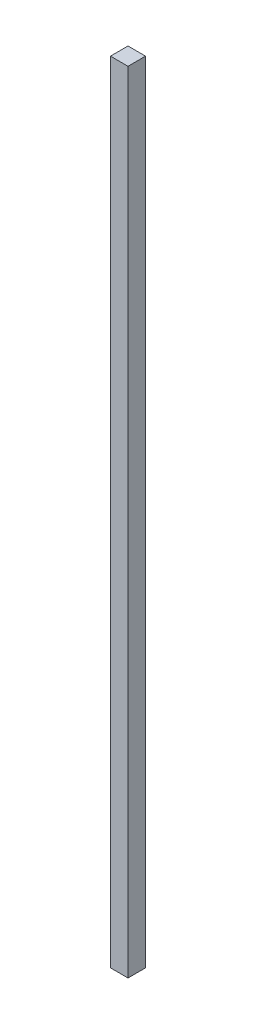
ISO-10303-21;
HEADER;
FILE_DESCRIPTION(('STEP AP214'),'2;1');
FILE_NAME('part.step','',(''),(''),'','','');
FILE_SCHEMA(('AUTOMOTIVE_DESIGN { 1 0 10303 214 1 1 1 1 }'));
ENDSEC;
DATA;
#1=APPLICATION_CONTEXT('core data for automotive mechanical design processes');
#2=APPLICATION_PROTOCOL_DEFINITION('international standard','automotive_design',2000,#1);
#3=PRODUCT_CONTEXT('',#1,'mechanical');
#4=PRODUCT('Part','Part','',(#3));
#5=PRODUCT_RELATED_PRODUCT_CATEGORY('part','',(#4));
#6=PRODUCT_DEFINITION_FORMATION('','',#4);
#7=PRODUCT_DEFINITION_CONTEXT('part definition',#1,'design');
#8=PRODUCT_DEFINITION('design','',#6,#7);
#9=PRODUCT_DEFINITION_SHAPE('','',#8);
#10=(LENGTH_UNIT() NAMED_UNIT(*) SI_UNIT(.MILLI.,.METRE.));
#11=(NAMED_UNIT(*) PLANE_ANGLE_UNIT() SI_UNIT($,.RADIAN.));
#12=(NAMED_UNIT(*) SI_UNIT($,.STERADIAN.) SOLID_ANGLE_UNIT());
#13=UNCERTAINTY_MEASURE_WITH_UNIT(LENGTH_MEASURE(1.E-05),#10,'distance_accuracy_value','');
#14=(GEOMETRIC_REPRESENTATION_CONTEXT(3) GLOBAL_UNCERTAINTY_ASSIGNED_CONTEXT((#13)) GLOBAL_UNIT_ASSIGNED_CONTEXT((#10,
#11,#12)) REPRESENTATION_CONTEXT('',''));
#15=CARTESIAN_POINT('',(0.,0.,0.));
#16=DIRECTION('',(0.,0.,1.));
#17=DIRECTION('',(1.,0.,0.));
#18=AXIS2_PLACEMENT_3D('',#15,#16,#17);
#19=CARTESIAN_POINT('',(10.,900.,-10.));
#20=DIRECTION('',(-1.,0.,0.));
#21=DIRECTION('',(0.,0.,1.));
#22=AXIS2_PLACEMENT_3D('',#19,#20,#21);
#23=PLANE('',#22);
#24=DIRECTION('',(0.,0.,-1.));
#25=VECTOR('',#24,1.);
#26=CARTESIAN_POINT('',(10.,0.,-10.));
#27=LINE('',#26,#25);
#28=CARTESIAN_POINT('',(10.,0.,10.));
#29=VERTEX_POINT('',#28);
#30=CARTESIAN_POINT('',(10.,0.,-10.));
#31=VERTEX_POINT('',#30);
#32=EDGE_CURVE('E100',#29,#31,#27,.T.);
#33=ORIENTED_EDGE('',*,*,#32,.T.);
#34=DIRECTION('',(0.,-1.,0.));
#35=VECTOR('',#34,1.);
#36=CARTESIAN_POINT('',(10.,900.,-10.));
#37=LINE('',#36,#35);
#38=CARTESIAN_POINT('',(10.,900.,-10.));
#39=VERTEX_POINT('',#38);
#40=EDGE_CURVE('E11',#39,#31,#37,.T.);
#41=ORIENTED_EDGE('',*,*,#40,.F.);
#42=DIRECTION('',(0.,0.,-1.));
#43=VECTOR('',#42,1.);
#44=CARTESIAN_POINT('',(10.,900.,-10.));
#45=LINE('',#44,#43);
#46=CARTESIAN_POINT('',(10.,900.,10.));
#47=VERTEX_POINT('',#46);
#48=EDGE_CURVE('E88',#47,#39,#45,.T.);
#49=ORIENTED_EDGE('',*,*,#48,.F.);
#50=DIRECTION('',(0.,-1.,0.));
#51=VECTOR('',#50,1.);
#52=CARTESIAN_POINT('',(10.,900.,10.));
#53=LINE('',#52,#51);
#54=EDGE_CURVE('E96',#47,#29,#53,.T.);
#55=ORIENTED_EDGE('',*,*,#54,.T.);
#56=EDGE_LOOP('',(#33,#41,#49,#55));
#57=FACE_BOUND('',#56,.T.);
#58=ADVANCED_FACE('F37',(#57),#23,.F.);
#59=CARTESIAN_POINT('',(-10.,900.,-10.));
#60=DIRECTION('',(0.,0.,1.));
#61=DIRECTION('',(1.,0.,0.));
#62=AXIS2_PLACEMENT_3D('',#59,#60,#61);
#63=PLANE('',#62);
#64=DIRECTION('',(-1.,0.,0.));
#65=VECTOR('',#64,1.);
#66=CARTESIAN_POINT('',(-10.,0.,-10.));
#67=LINE('',#66,#65);
#68=CARTESIAN_POINT('',(-10.,0.,-10.));
#69=VERTEX_POINT('',#68);
#70=EDGE_CURVE('E92',#31,#69,#67,.T.);
#71=ORIENTED_EDGE('',*,*,#70,.T.);
#72=DIRECTION('',(0.,-1.,0.));
#73=VECTOR('',#72,1.);
#74=CARTESIAN_POINT('',(-10.,900.,-10.));
#75=LINE('',#74,#73);
#76=CARTESIAN_POINT('',(-10.,900.,-10.));
#77=VERTEX_POINT('',#76);
#78=EDGE_CURVE('E45',#77,#69,#75,.T.);
#79=ORIENTED_EDGE('',*,*,#78,.F.);
#80=DIRECTION('',(-1.,0.,0.));
#81=VECTOR('',#80,1.);
#82=CARTESIAN_POINT('',(-10.,900.,-10.));
#83=LINE('',#82,#81);
#84=EDGE_CURVE('E83',#39,#77,#83,.T.);
#85=ORIENTED_EDGE('',*,*,#84,.F.);
#86=ORIENTED_EDGE('',*,*,#40,.T.);
#87=EDGE_LOOP('',(#71,#79,#85,#86));
#88=FACE_BOUND('',#87,.T.);
#89=ADVANCED_FACE('F91',(#88),#63,.F.);
#90=CARTESIAN_POINT('',(-10.,900.,-10.));
#91=DIRECTION('',(1.,0.,0.));
#92=DIRECTION('',(0.,0.,-1.));
#93=AXIS2_PLACEMENT_3D('',#90,#91,#92);
#94=PLANE('',#93);
#95=DIRECTION('',(0.,0.,1.));
#96=VECTOR('',#95,1.);
#97=CARTESIAN_POINT('',(-10.,0.,-10.));
#98=LINE('',#97,#96);
#99=CARTESIAN_POINT('',(-10.,0.,10.));
#100=VERTEX_POINT('',#99);
#101=EDGE_CURVE('E70',#69,#100,#98,.T.);
#102=ORIENTED_EDGE('',*,*,#101,.T.);
#103=DIRECTION('',(0.,-1.,0.));
#104=VECTOR('',#103,1.);
#105=CARTESIAN_POINT('',(-10.,900.,10.));
#106=LINE('',#105,#104);
#107=CARTESIAN_POINT('',(-10.,900.,10.));
#108=VERTEX_POINT('',#107);
#109=EDGE_CURVE('E93',#108,#100,#106,.T.);
#110=ORIENTED_EDGE('',*,*,#109,.F.);
#111=DIRECTION('',(0.,0.,1.));
#112=VECTOR('',#111,1.);
#113=CARTESIAN_POINT('',(-10.,900.,-10.));
#114=LINE('',#113,#112);
#115=EDGE_CURVE('E86',#77,#108,#114,.T.);
#116=ORIENTED_EDGE('',*,*,#115,.F.);
#117=ORIENTED_EDGE('',*,*,#78,.T.);
#118=EDGE_LOOP('',(#102,#110,#116,#117));
#119=FACE_BOUND('',#118,.T.);
#120=ADVANCED_FACE('F94',(#119),#94,.F.);
#121=CARTESIAN_POINT('',(-10.,900.,10.));
#122=DIRECTION('',(0.,0.,-1.));
#123=DIRECTION('',(-1.,0.,0.));
#124=AXIS2_PLACEMENT_3D('',#121,#122,#123);
#125=PLANE('',#124);
#126=DIRECTION('',(1.,0.,0.));
#127=VECTOR('',#126,1.);
#128=CARTESIAN_POINT('',(-10.,0.,10.));
#129=LINE('',#128,#127);
#130=EDGE_CURVE('E76',#100,#29,#129,.T.);
#131=ORIENTED_EDGE('',*,*,#130,.T.);
#132=ORIENTED_EDGE('',*,*,#54,.F.);
#133=DIRECTION('',(1.,0.,0.));
#134=VECTOR('',#133,1.);
#135=CARTESIAN_POINT('',(-10.,900.,10.));
#136=LINE('',#135,#134);
#137=EDGE_CURVE('E53',#108,#47,#136,.T.);
#138=ORIENTED_EDGE('',*,*,#137,.F.);
#139=ORIENTED_EDGE('',*,*,#109,.T.);
#140=EDGE_LOOP('',(#131,#132,#138,#139));
#141=FACE_BOUND('',#140,.T.);
#142=ADVANCED_FACE('F107',(#141),#125,.F.);
#143=CARTESIAN_POINT('',(0.,900.,0.));
#144=DIRECTION('',(0.,1.,0.));
#145=DIRECTION('',(0.,0.,1.));
#146=AXIS2_PLACEMENT_3D('',#143,#144,#145);
#147=PLANE('',#146);
#148=ORIENTED_EDGE('',*,*,#48,.T.);
#149=ORIENTED_EDGE('',*,*,#84,.T.);
#150=ORIENTED_EDGE('',*,*,#115,.T.);
#151=ORIENTED_EDGE('',*,*,#137,.T.);
#152=EDGE_LOOP('',(#148,#149,#150,#151));
#153=FACE_BOUND('',#152,.T.);
#154=ADVANCED_FACE('F84',(#153),#147,.T.);
#155=CARTESIAN_POINT('',(0.,0.,0.));
#156=DIRECTION('',(0.,1.,0.));
#157=DIRECTION('',(0.,0.,1.));
#158=AXIS2_PLACEMENT_3D('',#155,#156,#157);
#159=PLANE('',#158);
#160=ORIENTED_EDGE('',*,*,#32,.F.);
#161=ORIENTED_EDGE('',*,*,#130,.F.);
#162=ORIENTED_EDGE('',*,*,#101,.F.);
#163=ORIENTED_EDGE('',*,*,#70,.F.);
#164=EDGE_LOOP('',(#160,#161,#162,#163));
#165=FACE_BOUND('',#164,.T.);
#166=ADVANCED_FACE('F110',(#165),#159,.F.);
#167=CLOSED_SHELL('',(#58,#89,#120,#142,#154,#166));
#168=MANIFOLD_SOLID_BREP('B2',#167);
#169=ADVANCED_BREP_SHAPE_REPRESENTATION('',(#18,#168),#14);
#170=SHAPE_DEFINITION_REPRESENTATION(#9,#169);
ENDSEC;
END-ISO-10303-21;
